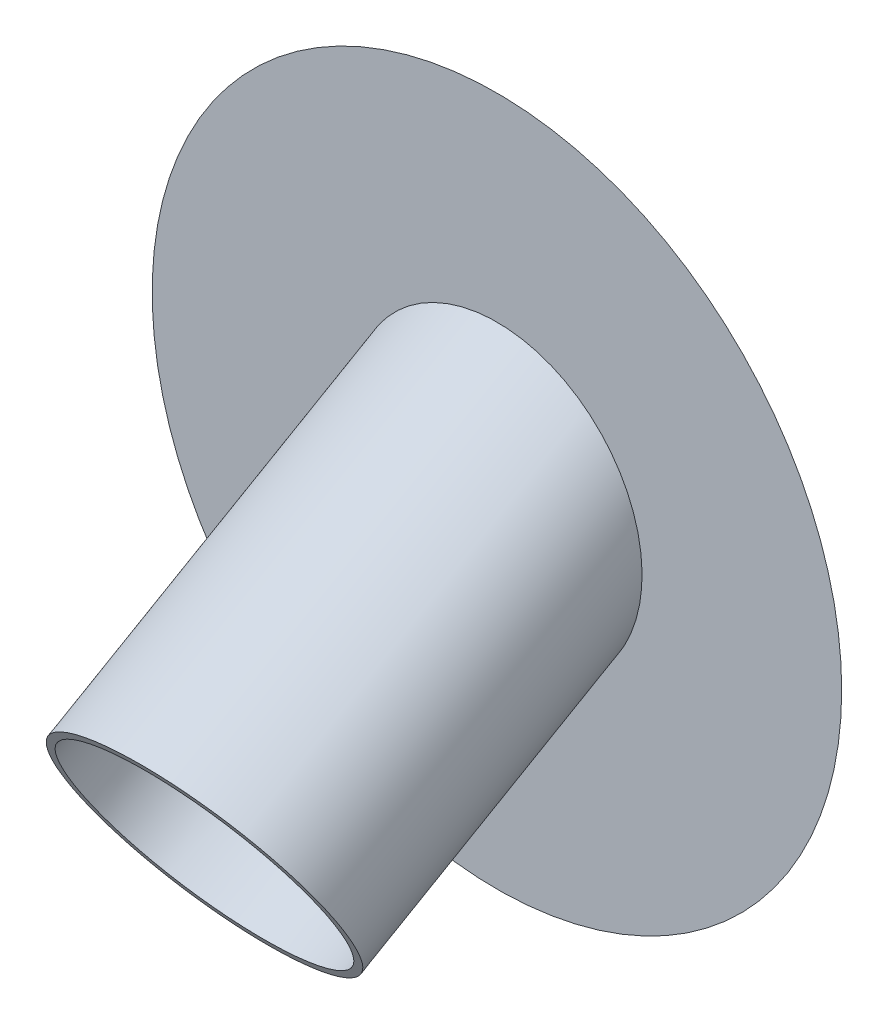
ISO-10303-21;
HEADER;
FILE_DESCRIPTION(('STEP AP214'),'2;1');
FILE_NAME('part.step','',(''),(''),'','','');
FILE_SCHEMA(('AUTOMOTIVE_DESIGN { 1 0 10303 214 1 1 1 1 }'));
ENDSEC;
DATA;
#1=APPLICATION_CONTEXT('core data for automotive mechanical design processes');
#2=APPLICATION_PROTOCOL_DEFINITION('international standard','automotive_design',2000,#1);
#3=PRODUCT_CONTEXT('',#1,'mechanical');
#4=PRODUCT('Part','Part','',(#3));
#5=PRODUCT_RELATED_PRODUCT_CATEGORY('part','',(#4));
#6=PRODUCT_DEFINITION_FORMATION('','',#4);
#7=PRODUCT_DEFINITION_CONTEXT('part definition',#1,'design');
#8=PRODUCT_DEFINITION('design','',#6,#7);
#9=PRODUCT_DEFINITION_SHAPE('','',#8);
#10=(LENGTH_UNIT() NAMED_UNIT(*) SI_UNIT(.MILLI.,.METRE.));
#11=(NAMED_UNIT(*) PLANE_ANGLE_UNIT() SI_UNIT($,.RADIAN.));
#12=(NAMED_UNIT(*) SI_UNIT($,.STERADIAN.) SOLID_ANGLE_UNIT());
#13=UNCERTAINTY_MEASURE_WITH_UNIT(LENGTH_MEASURE(1.E-05),#10,'distance_accuracy_value','');
#14=(GEOMETRIC_REPRESENTATION_CONTEXT(3) GLOBAL_UNCERTAINTY_ASSIGNED_CONTEXT((#13)) GLOBAL_UNIT_ASSIGNED_CONTEXT((#10,
#11,#12)) REPRESENTATION_CONTEXT('',''));
#15=CARTESIAN_POINT('',(0.,0.,0.));
#16=DIRECTION('',(0.,0.,1.));
#17=DIRECTION('',(1.,0.,0.));
#18=AXIS2_PLACEMENT_3D('',#15,#16,#17);
#19=CARTESIAN_POINT('',(-18.2080308915422,26.0465192443004,-45.1138946914487));
#20=CARTESIAN_POINT('',(-18.2080308915422,25.0686767320751,-45.678452329107));
#21=CARTESIAN_POINT('',(-18.0720908259398,24.1111858148349,-46.2312599679223));
#22=CARTESIAN_POINT('',(-17.6755524278814,22.7037878327175,-47.0438215717547));
#23=CARTESIAN_POINT('',(-17.5101059659842,22.2375221611436,-47.3130201827518));
#24=CARTESIAN_POINT('',(-17.1170157653334,21.3239029057431,-47.8404985057941));
#25=CARTESIAN_POINT('',(-16.8915451322552,20.8808004251776,-48.0963238422272));
#26=CARTESIAN_POINT('',(-16.386141843818,20.0204037683929,-48.5930740836317));
#27=CARTESIAN_POINT('',(-16.1061957936727,19.603115939656,-48.8339953238825));
#28=CARTESIAN_POINT('',(-15.4932874154907,18.7936634813918,-49.3013329185575));
#29=CARTESIAN_POINT('',(-15.1583281194544,18.3995099248571,-49.5288975805249));
#30=CARTESIAN_POINT('',(-14.0901279097118,17.2716251888331,-50.1800821364832));
#31=CARTESIAN_POINT('',(-13.2973567872076,16.5929598669222,-50.5719097427781));
#32=CARTESIAN_POINT('',(-11.9980504768333,15.6750308132245,-51.1018763290275));
#33=CARTESIAN_POINT('',(-11.5442983032577,15.3846946326905,-51.2695020010143));
#34=CARTESIAN_POINT('',(-10.6111325932973,14.8439020628175,-51.5817287368062));
#35=CARTESIAN_POINT('',(-10.1328742402689,14.5938077809624,-51.7261207377581));
#36=CARTESIAN_POINT('',(-8.66502453452607,13.9010369640562,-52.1260921553855));
#37=CARTESIAN_POINT('',(-7.6426340631868,13.5153933542508,-52.3487435973179));
#38=CARTESIAN_POINT('',(-6.04531878376521,13.0477444520507,-52.6187408168894));
#39=CARTESIAN_POINT('',(-5.50584481320515,12.9116475773344,-52.6973163841427));
#40=CARTESIAN_POINT('',(-4.42250225776547,12.6796758600995,-52.8312453175327));
#41=CARTESIAN_POINT('',(-3.87719928441678,12.5833790191343,-52.886842324586));
#42=CARTESIAN_POINT('',(-2.23067046471249,12.3520636383215,-53.020392321966));
#43=CARTESIAN_POINT('',(-1.11737611958802,12.2741351508091,-53.0653843552088));
#44=CARTESIAN_POINT('',(1.13180209622181,12.2748083518274,-53.0649956824197));
#45=CARTESIAN_POINT('',(2.24153578156134,12.3531866523204,-53.0197439495314));
#46=CARTESIAN_POINT('',(4.43210774505371,12.6617428193338,-52.8415989634462));
#47=CARTESIAN_POINT('',(5.51295796158799,12.8918579685817,-52.7087419200832));
#48=CARTESIAN_POINT('',(7.11087843525395,13.3597234181207,-52.4386196768474));
#49=CARTESIAN_POINT('',(7.63421341629993,13.534805362123,-52.3375360693474));
#50=CARTESIAN_POINT('',(8.65462780134358,13.9204976918949,-52.1148564989293));
#51=CARTESIAN_POINT('',(9.15296392506364,14.131470488366,-51.9930512980949));
#52=CARTESIAN_POINT('',(10.6118329406213,14.8195721806204,-51.595775600842));
#53=CARTESIAN_POINT('',(11.5366487753278,15.3512395469268,-51.2888173037857));
#54=CARTESIAN_POINT('',(12.8435856783609,16.2713352976508,-50.757599774425));
#55=CARTESIAN_POINT('',(13.2639854704254,16.5978361316961,-50.5690944299983));
#56=CARTESIAN_POINT('',(14.0559213384341,17.2773366901,-50.1767845996893));
#57=CARTESIAN_POINT('',(14.4300770360119,17.6321072568038,-49.9719577175023));
#58=CARTESIAN_POINT('',(15.4858281638205,18.7423607372323,-49.3309525717082));
#59=CARTESIAN_POINT('',(16.1016181721902,19.543158415395,-48.8686118166545));
#60=CARTESIAN_POINT('',(17.1319915091084,21.2833082105735,-47.8639358639779));
#61=CARTESIAN_POINT('',(17.5248736951707,22.1871894752777,-47.3420797724855));
#62=CARTESIAN_POINT('',(17.9269650589811,23.587747310811,-46.5334673291247));
#63=CARTESIAN_POINT('',(18.0297489576968,24.0624473765785,-46.2593991183695));
#64=CARTESIAN_POINT('',(18.1346433745884,24.7868743196363,-45.8411510277869));
#65=CARTESIAN_POINT('',(18.161403727515,25.0312651386358,-45.70005192265));
#66=CARTESIAN_POINT('',(18.1974797572798,25.5179193583012,-45.4190819779239));
#67=CARTESIAN_POINT('',(18.2069220555508,25.7606221748995,-45.2789574414279));
#68=CARTESIAN_POINT('',(18.2120062462621,26.971076619007,-44.5801012422806));
#69=CARTESIAN_POINT('',(18.0826563629694,27.9297502925213,-44.0266107388121));
#70=CARTESIAN_POINT('',(17.6876454398434,29.3531635019524,-43.204802739179));
#71=CARTESIAN_POINT('',(17.5229092447295,29.8212552483206,-42.9345498434079));
#72=CARTESIAN_POINT('',(17.1357129726102,30.7298326961115,-42.4099824093462));
#73=CARTESIAN_POINT('',(16.9125957663502,31.172766725982,-42.1542543279672));
#74=CARTESIAN_POINT('',(16.409230545134,32.0366590646814,-41.6554858536682));
#75=CARTESIAN_POINT('',(16.1287085802233,32.457970869553,-41.4122413697129));
#76=CARTESIAN_POINT('',(15.5116656231737,33.2771808919475,-40.9392702427605));
#77=CARTESIAN_POINT('',(15.1799440213041,33.6688229083279,-40.7131556191773));
#78=CARTESIAN_POINT('',(14.1199210959585,34.7935317214935,-40.0638046831362));
#79=CARTESIAN_POINT('',(13.3256039010775,35.4780681645875,-39.6685873834458));
#80=CARTESIAN_POINT('',(11.5802540246892,36.7151748912716,-38.9543434817784));
#81=CARTESIAN_POINT('',(10.6513387869154,37.2526334146858,-38.644041658607));
#82=CARTESIAN_POINT('',(9.181809431582,37.9490085011643,-38.2419893149717));
#83=CARTESIAN_POINT('',(8.67916469762992,38.1626744362771,-38.1186292298176));
#84=CARTESIAN_POINT('',(7.64849251479404,38.5534060888704,-37.893040205012));
#85=CARTESIAN_POINT('',(7.12242305542902,38.7295371255395,-37.7913509035784));
#86=CARTESIAN_POINT('',(5.53324039305754,39.1960212781778,-37.5220261524801));
#87=CARTESIAN_POINT('',(4.45150148139667,39.4280071057587,-37.388089072478));
#88=CARTESIAN_POINT('',(2.79672091068246,39.6619245233493,-37.2530367884639));
#89=CARTESIAN_POINT('',(2.23858034597459,39.7208363595307,-37.2190240239862));
#90=CARTESIAN_POINT('',(1.11625154074938,39.7992916680637,-37.1737278304853));
#91=CARTESIAN_POINT('',(0.556840381311056,39.8185879727329,-37.1625871037901));
#92=CARTESIAN_POINT('',(-1.11629562777199,39.8185274574704,-37.1626220422933));
#93=CARTESIAN_POINT('',(-2.22496517962788,39.7417006248081,-37.2069780348118));
#94=CARTESIAN_POINT('',(-3.8776924508454,39.5096279761457,-37.3409652409886));
#95=CARTESIAN_POINT('',(-4.42716619974421,39.4126186085706,-37.396973625472));
#96=CARTESIAN_POINT('',(-5.52133583584159,39.177814496966,-37.5325378425138));
#97=CARTESIAN_POINT('',(-6.05873045411751,39.0416035537296,-37.6111792672579));
#98=CARTESIAN_POINT('',(-7.64222617869835,38.5772864424617,-37.8792528764377));
#99=CARTESIAN_POINT('',(-8.65990580361272,38.1940135640715,-38.1005355759494));
#100=CARTESIAN_POINT('',(-10.126355404483,37.502507394055,-38.4997768493547));
#101=CARTESIAN_POINT('',(-10.6050978365776,37.2524512883335,-38.6441468093055));
#102=CARTESIAN_POINT('',(-11.5409957680289,36.7104383733515,-38.9570781116746));
#103=CARTESIAN_POINT('',(-11.9946235408695,36.420234695629,-39.1246272831275));
#104=CARTESIAN_POINT('',(-13.2916283534485,35.5045108711448,-39.6533206796968));
#105=CARTESIAN_POINT('',(-14.0802621650459,34.8295710684043,-40.0429973564958));
#106=CARTESIAN_POINT('',(-15.1406635813506,33.7132739330303,-40.6874918080997));
#107=CARTESIAN_POINT('',(-15.4735665060795,33.3237422028272,-40.9123880573903));
#108=CARTESIAN_POINT('',(-16.0946496555651,32.5067664379208,-41.3840692351804));
#109=CARTESIAN_POINT('',(-16.3778960246247,32.08547095179,-41.6273042975064));
#110=CARTESIAN_POINT('',(-17.1380802641165,30.7948874369127,-42.3724230372325));
#111=CARTESIAN_POINT('',(-17.5301935656011,29.8944213338146,-42.8923073842523));
#112=CARTESIAN_POINT('',(-17.933432187474,28.4790922846711,-43.7094479917672));
#113=CARTESIAN_POINT('',(-18.0366891952287,27.9945875758858,-43.9891769158081));
#114=CARTESIAN_POINT('',(-18.1735275256795,27.0247205367756,-44.5491299119165));
#115=CARTESIAN_POINT('',(-18.2080308915422,26.5354405004131,-44.8316158726195));
#116=CARTESIAN_POINT('',(-18.2080308915422,26.0465192443004,-45.1138946914487));
#117=B_SPLINE_CURVE_WITH_KNOTS('',3,(#19,#20,#21,#22,#23,#24,#25,#26,#27,#28,#29,#30,#31,#32,
#33,#34,#35,#36,#37,#38,#39,#40,#41,#42,#43,#44,#45,#46,#47,#48,#49,#50,#51,#52,#53,#54,#55,#56,
#57,#58,#59,#60,#61,#62,#63,#64,#65,#66,#67,#68,#69,#70,#71,#72,#73,#74,#75,#76,#77,#78,#79,#80,
#81,#82,#83,#84,#85,#86,#87,#88,#89,#90,#91,#92,#93,#94,#95,#96,#97,#98,#99,#100,#101,#102,#103,
#104,#105,#106,#107,#108,#109,#110,#111,#112,#113,#114,#115,#116),.UNSPECIFIED.,.T.,.F.,(4,2,2,
2,2,2,2,2,2,2,2,2,2,2,2,2,2,2,2,2,2,2,2,2,2,2,2,2,2,2,2,2,2,2,2,2,2,2,2,2,2,2,2,2,2,2,2,2,4),
(0.,0.03125,0.046875,0.0625000000000001,0.0781250000000001,0.0937500000000002,0.125,0.140625,
0.15625,0.1875,0.203125,0.21875,0.25,0.28125,0.3125,0.328125,0.34375,0.375,0.390625,0.40625,
0.4375,0.46875,0.484375,0.4921875,0.5,0.53125,0.546875,0.5625,0.578125,0.59375,0.625,0.65625,
0.671875,0.6875,0.71875,0.734375,0.75,0.78125,0.796875,0.8125,0.84375,0.859375,0.875,0.90625,
0.921875,0.9375,0.96875,0.984375,1.),.UNSPECIFIED.);
#118=DIRECTION('',(0.,-0.500000000000001,0.866025403784438));
#119=VECTOR('',#118,1.);
#120=SURFACE_OF_LINEAR_EXTRUSION('',#117,#119);
#121=CARTESIAN_POINT('',(-18.2080308915422,0.,0.));
#122=CARTESIAN_POINT('',(-18.207969405308,0.592622129350855,0.));
#123=CARTESIAN_POINT('',(-18.1795638226183,1.1855950613576,0.));
#124=CARTESIAN_POINT('',(-18.108624910561,1.9230446008679,0.));
#125=CARTESIAN_POINT('',(-18.0926519835811,2.07045145279375,0.));
#126=CARTESIAN_POINT('',(-18.0571481369632,2.36483329247356,0.));
#127=CARTESIAN_POINT('',(-18.0376175157474,2.51180831539974,0.));
#128=CARTESIAN_POINT('',(-17.9737907391131,2.9519780260343,0.));
#129=CARTESIAN_POINT('',(-17.9242585693009,3.2444287377518,0.));
#130=CARTESIAN_POINT('',(-17.8110863396817,3.8271057667507,0.));
#131=CARTESIAN_POINT('',(-17.7474218991262,4.11732733212051,0.));
#132=CARTESIAN_POINT('',(-17.6062666898334,4.69436834180093,0.));
#133=CARTESIAN_POINT('',(-17.5287768995074,4.98118802532975,0.));
#134=CARTESIAN_POINT('',(-17.3600168360541,5.55064327353075,0.));
#135=CARTESIAN_POINT('',(-17.2687513371096,5.83328025066621,0.));
#136=CARTESIAN_POINT('',(-17.0726064416325,6.39385507239992,0.));
#137=CARTESIAN_POINT('',(-16.9677233608618,6.67179162221294,0.));
#138=CARTESIAN_POINT('',(-16.6608061118697,7.42941729166875,0.));
#139=CARTESIAN_POINT('',(-16.4450354278203,7.90361692178952,0.));
#140=CARTESIAN_POINT('',(-15.9741364605243,8.83203198793285,0.));
#141=CARTESIAN_POINT('',(-15.7190110438114,9.28624887637092,0.));
#142=CARTESIAN_POINT('',(-15.3082586355767,9.94981880041805,0.));
#143=CARTESIAN_POINT('',(-15.1667059834294,10.1679927667297,0.));
#144=CARTESIAN_POINT('',(-14.8744641203259,10.5981250766664,0.));
#145=CARTESIAN_POINT('',(-14.7237756526375,10.8100839238623,0.));
#146=CARTESIAN_POINT('',(-14.4135748289044,11.2274465484515,0.));
#147=CARTESIAN_POINT('',(-14.2540624184905,11.4328502854428,0.));
#148=CARTESIAN_POINT('',(-13.9264012492842,11.8366538614833,0.));
#149=CARTESIAN_POINT('',(-13.7582518797199,12.0350532035305,0.));
#150=CARTESIAN_POINT('',(-13.2432832127265,12.6168856345335,0.));
#151=CARTESIAN_POINT('',(-12.8840663569621,12.9894787678725,0.));
#152=CARTESIAN_POINT('',(-12.1354792124237,13.7028979120216,0.));
#153=CARTESIAN_POINT('',(-11.7461086435404,14.0437236276671,0.));
#154=CARTESIAN_POINT('',(-10.9396657419227,14.6911225458464,0.));
#155=CARTESIAN_POINT('',(-10.5225902910895,14.9976918824807,0.));
#156=CARTESIAN_POINT('',(-9.87862318347301,15.4299495273045,0.));
#157=CARTESIAN_POINT('',(-9.66087820964556,15.5694527895523,0.));
#158=CARTESIAN_POINT('',(-9.21967542331068,15.8390988775594,0.));
#159=CARTESIAN_POINT('',(-8.99621817476299,15.9692426225617,0.));
#160=CARTESIAN_POINT('',(-8.54581106303305,16.2187986676365,0.));
#161=CARTESIAN_POINT('',(-8.31890548806177,16.3382909606145,0.));
#162=CARTESIAN_POINT('',(-7.86027097983319,16.5674722972506,0.));
#163=CARTESIAN_POINT('',(-7.62854332245112,16.6771638944162,0.));
#164=CARTESIAN_POINT('',(-7.16061142588904,16.88661980412,0.));
#165=CARTESIAN_POINT('',(-6.92440675187805,16.986383146432,0.));
#166=CARTESIAN_POINT('',(-6.44800701940456,17.1758598755121,0.));
#167=CARTESIAN_POINT('',(-6.20781168157481,17.2655725552485,0.));
#168=CARTESIAN_POINT('',(-5.48184213211329,17.5192489818608,0.));
#169=CARTESIAN_POINT('',(-4.99053994350464,17.6678158193206,0.));
#170=CARTESIAN_POINT('',(-4.24566540667484,17.8589566799071,0.));
#171=CARTESIAN_POINT('',(-3.99601932424301,17.9173911687568,0.));
#172=CARTESIAN_POINT('',(-3.49447366288117,18.0235920102107,0.));
#173=CARTESIAN_POINT('',(-3.24257433417632,18.0713595324632,0.));
#174=CARTESIAN_POINT('',(-2.7386549379042,18.1559152113362,0.));
#175=CARTESIAN_POINT('',(-2.48664671438149,18.1927739741889,0.));
#176=CARTESIAN_POINT('',(-1.9813174904148,18.2557750586611,0.));
#177=CARTESIAN_POINT('',(-1.72799650342722,18.2819174899086,0.));
#178=CARTESIAN_POINT('',(-0.966693144790526,18.3441731720162,0.));
#179=CARTESIAN_POINT('',(-0.457258550230268,18.3641335928166,0.));
#180=CARTESIAN_POINT('',(0.306587991134367,18.361918507321,0.));
#181=CARTESIAN_POINT('',(0.561178012367745,18.3558186448419,0.));
#182=CARTESIAN_POINT('',(1.06987006785161,18.3328504216701,0.));
#183=CARTESIAN_POINT('',(1.32397210712798,18.3159821724873,0.));
#184=CARTESIAN_POINT('',(2.08488643362869,18.2492867634372,0.));
#185=CARTESIAN_POINT('',(2.59041786877504,18.1833686074652,0.));
#186=CARTESIAN_POINT('',(3.34240383232563,18.0528452822705,0.));
#187=CARTESIAN_POINT('',(3.59175352077423,18.0041313544814,0.));
#188=CARTESIAN_POINT('',(4.08819991435678,17.8962849744248,0.));
#189=CARTESIAN_POINT('',(4.33529673309737,17.8371530506015,0.));
#190=CARTESIAN_POINT('',(4.82676124957489,17.7084924937651,0.));
#191=CARTESIAN_POINT('',(5.07112901672341,17.6389641258289,0.));
#192=CARTESIAN_POINT('',(5.55671384884555,17.4896401707965,0.));
#193=CARTESIAN_POINT('',(5.79793062388423,17.4098436461164,0.));
#194=CARTESIAN_POINT('',(6.51609070509549,17.1554118577277,0.));
#195=CARTESIAN_POINT('',(6.98778576687587,16.9656708768516,0.));
#196=CARTESIAN_POINT('',(7.91374413865358,16.547256497799,0.));
#197=CARTESIAN_POINT('',(8.36799946929043,16.3185655326012,0.));
#198=CARTESIAN_POINT('',(9.25672820570247,15.8232573525966,0.));
#199=CARTESIAN_POINT('',(9.6911564870907,15.5565588152807,0.));
#200=CARTESIAN_POINT('',(10.3247621593441,15.1301523807704,0.));
#201=CARTESIAN_POINT('',(10.5329369378,14.983640625361,0.));
#202=CARTESIAN_POINT('',(10.9429258069465,14.6819723852647,0.));
#203=CARTESIAN_POINT('',(11.1447399660158,14.52681599356,0.));
#204=CARTESIAN_POINT('',(11.7401731690832,14.0487402753812,0.));
#205=CARTESIAN_POINT('',(12.1237810936137,13.7132156476854,0.));
#206=CARTESIAN_POINT('',(12.8617723125446,13.0115135054858,0.));
#207=CARTESIAN_POINT('',(13.2161553397196,12.6453357107585,0.));
#208=CARTESIAN_POINT('',(13.8949757691768,11.8823299822485,0.));
#209=CARTESIAN_POINT('',(14.2192250912123,11.4853346811375,0.));
#210=CARTESIAN_POINT('',(14.8334726524049,10.6656097521367,0.));
#211=CARTESIAN_POINT('',(15.1234706732886,10.2428799602747,0.));
#212=CARTESIAN_POINT('',(15.5311517467388,9.59177724298184,0.));
#213=CARTESIAN_POINT('',(15.6625158053793,9.37186364102246,0.));
#214=CARTESIAN_POINT('',(15.9159316234002,8.92680847312022,0.));
#215=CARTESIAN_POINT('',(16.0379857707565,8.7016682672486,0.));
#216=CARTESIAN_POINT('',(16.3899051377146,8.01886579671802,0.));
#217=CARTESIAN_POINT('',(16.6055512245954,7.55378342797094,0.));
#218=CARTESIAN_POINT('',(16.9990198862518,6.60343244536605,0.));
#219=CARTESIAN_POINT('',(17.1765198740753,6.11803020506357,0.));
#220=CARTESIAN_POINT('',(17.4117349945531,5.38014998294476,0.));
#221=CARTESIAN_POINT('',(17.4849754898834,5.13252572728701,0.));
#222=CARTESIAN_POINT('',(17.621072645871,4.63444643618591,0.));
#223=CARTESIAN_POINT('',(17.6839302003305,4.38399164639062,0.));
#224=CARTESIAN_POINT('',(17.7991033647779,3.88065328785536,0.));
#225=CARTESIAN_POINT('',(17.85141812981,3.62776952614479,0.));
#226=CARTESIAN_POINT('',(17.9454933576838,3.12004777877314,0.));
#227=CARTESIAN_POINT('',(17.9872539145315,2.86520981053899,0.));
#228=CARTESIAN_POINT('',(18.0600455981777,2.35400679635999,0.));
#229=CARTESIAN_POINT('',(18.0910768150229,2.09764176324951,0.));
#230=CARTESIAN_POINT('',(18.1423409024711,1.58383230682876,0.));
#231=CARTESIAN_POINT('',(18.1625736135528,1.32638786762954,0.));
#232=CARTESIAN_POINT('',(18.1923272878807,0.809155734538497,0.));
#233=CARTESIAN_POINT('',(18.2017760437612,0.549363850677787,0.));
#234=CARTESIAN_POINT('',(18.2098250435268,0.0296478948586195,0.));
#235=CARTESIAN_POINT('',(18.2084257486393,-0.230276171009996,0.));
#236=CARTESIAN_POINT('',(18.1878114923539,-1.0096596677335,0.));
#237=CARTESIAN_POINT('',(18.1521855538013,-1.5288238711787,0.));
#238=CARTESIAN_POINT('',(18.0661940861123,-2.30368551485625,0.));
#239=CARTESIAN_POINT('',(18.0321041661965,-2.56132869085481,0.));
#240=CARTESIAN_POINT('',(17.9530944386196,-3.0749688154219,0.));
#241=CARTESIAN_POINT('',(17.9081748608463,-3.33096579881676,0.));
#242=CARTESIAN_POINT('',(17.8075926771346,-3.84095416966564,0.));
#243=CARTESIAN_POINT('',(17.7519251849848,-4.09494459002086,0.));
#244=CARTESIAN_POINT('',(17.6299845909589,-4.60036881693711,0.));
#245=CARTESIAN_POINT('',(17.5637114992524,-4.85180262594945,0.));
#246=CARTESIAN_POINT('',(17.4203540550402,-5.35246212814905,0.));
#247=CARTESIAN_POINT('',(17.3432349605249,-5.6016778758966,0.));
#248=CARTESIAN_POINT('',(17.1784742236986,-6.0966123168199,0.));
#249=CARTESIAN_POINT('',(17.0908323587776,-6.34233093589053,0.));
#250=CARTESIAN_POINT('',(16.9052311274268,-6.82972375987101,0.));
#251=CARTESIAN_POINT('',(16.807276024266,-7.07139958847598,0.));
#252=CARTESIAN_POINT('',(16.6012919061496,-7.55039271439029,0.));
#253=CARTESIAN_POINT('',(16.493263733594,-7.78771037418535,0.));
#254=CARTESIAN_POINT('',(16.267233123752,-8.25766105997812,0.));
#255=CARTESIAN_POINT('',(16.1492271283267,-8.49029237787392,0.));
#256=CARTESIAN_POINT('',(15.9034162630864,-8.95023712207335,0.));
#257=CARTESIAN_POINT('',(15.7756132148908,-9.17755152677057,0.));
#258=CARTESIAN_POINT('',(15.3777384059683,-9.8510170886634,0.));
#259=CARTESIAN_POINT('',(15.0931674477473,-10.2887603608911,0.));
#260=CARTESIAN_POINT('',(14.6404877435939,-10.9245138706731,0.));
#261=CARTESIAN_POINT('',(14.4858544326341,-11.1322895819759,0.));
#262=CARTESIAN_POINT('',(14.1679060494219,-11.5410816878455,0.));
#263=CARTESIAN_POINT('',(14.0045912193652,-11.7420982707223,0.));
#264=CARTESIAN_POINT('',(13.5020360886761,-12.3344833272216,0.));
#265=CARTESIAN_POINT('',(13.150122888188,-12.7152745639219,0.));
#266=CARTESIAN_POINT('',(12.5991525047006,-13.2629068409375,0.));
#267=CARTESIAN_POINT('',(12.4116242191833,-13.4415431007077,0.));
#268=CARTESIAN_POINT('',(12.0291553137343,-13.7907131365689,0.));
#269=CARTESIAN_POINT('',(11.8342150869418,-13.9612473413275,0.));
#270=CARTESIAN_POINT('',(11.4372457437677,-14.2938166895698,0.));
#271=CARTESIAN_POINT('',(11.2352171495758,-14.4558524569361,0.));
#272=CARTESIAN_POINT('',(10.8243570470643,-14.7711343384854,0.));
#273=CARTESIAN_POINT('',(10.6155243586252,-14.9243789150399,0.));
#274=CARTESIAN_POINT('',(10.1934078801344,-15.2204507944761,0.));
#275=CARTESIAN_POINT('',(9.98018136259135,-15.3633597167512,0.));
#276=CARTESIAN_POINT('',(9.54790567058852,-15.6400939956266,0.));
#277=CARTESIAN_POINT('',(9.3288559601596,-15.7739185120379,0.));
#278=CARTESIAN_POINT('',(8.66330304462266,-16.1613559619564,0.));
#279=CARTESIAN_POINT('',(8.20847756637456,-16.4008755832942,0.));
#280=CARTESIAN_POINT('',(7.2802274410172,-16.840424852325,0.));
#281=CARTESIAN_POINT('',(6.80680323682398,-17.04045543974,0.));
#282=CARTESIAN_POINT('',(5.84491846574702,-17.3996442658713,0.));
#283=CARTESIAN_POINT('',(5.35646522784527,-17.5588220836644,0.));
#284=CARTESIAN_POINT('',(4.37057668146055,-17.8340236028373,0.));
#285=CARTESIAN_POINT('',(3.8732083400864,-17.9502878252759,0.));
#286=CARTESIAN_POINT('',(2.87039933243379,-18.1406470154695,0.));
#287=CARTESIAN_POINT('',(2.36495864218468,-18.2147418579795,0.));
#288=CARTESIAN_POINT('',(1.60356488734472,-18.2934442192536,0.));
#289=CARTESIAN_POINT('',(1.34920101805328,-18.3142721775292,0.));
#290=CARTESIAN_POINT('',(0.839828248454309,-18.3451070003792,0.));
#291=CARTESIAN_POINT('',(0.584819350605908,-18.3551139061463,0.));
#292=CARTESIAN_POINT('',(-0.180517051648748,-18.3690044175357,0.));
#293=CARTESIAN_POINT('',(-0.691270921565309,-18.356769791906,0.));
#294=CARTESIAN_POINT('',(-1.45412314582678,-18.3060538881616,0.));
#295=CARTESIAN_POINT('',(-1.70743503525035,-18.2838193954391,0.));
#296=CARTESIAN_POINT('',(-2.21289768951477,-18.2286527041513,0.));
#297=CARTESIAN_POINT('',(-2.46504852527541,-18.195721168018,0.));
#298=CARTESIAN_POINT('',(-2.96771278505671,-18.1192719941994,0.));
#299=CARTESIAN_POINT('',(-3.21822636328677,-18.0757553686953,0.));
#300=CARTESIAN_POINT('',(-3.71725123675818,-17.9782177601517,0.));
#301=CARTESIAN_POINT('',(-3.96576201507223,-17.9241941502964,0.));
#302=CARTESIAN_POINT('',(-4.70744831298131,-17.746475147685,0.));
#303=CARTESIAN_POINT('',(-5.19695847799929,-17.6071041141677,0.));
#304=CARTESIAN_POINT('',(-6.16252157541092,-17.2876841276845,0.));
#305=CARTESIAN_POINT('',(-6.63857437194084,-17.1076347642007,0.));
#306=CARTESIAN_POINT('',(-7.34013330750256,-16.8081019019311,0.));
#307=CARTESIAN_POINT('',(-7.57200101688718,-16.7032940490764,0.));
#308=CARTESIAN_POINT('',(-8.0310947628422,-16.4839773280885,0.));
#309=CARTESIAN_POINT('',(-8.25832122014019,-16.3694693441555,0.));
#310=CARTESIAN_POINT('',(-8.70773236113942,-16.1309602868545,0.));
#311=CARTESIAN_POINT('',(-8.92991701432635,-16.0069591560514,0.));
#312=CARTESIAN_POINT('',(-9.36891393451156,-15.7497527321023,0.));
#313=CARTESIAN_POINT('',(-9.58572579931371,-15.6165467527106,0.));
#314=CARTESIAN_POINT('',(-10.0135723252212,-15.3411843725425,0.));
#315=CARTESIAN_POINT('',(-10.2246074534927,-15.1990286986167,0.));
#316=CARTESIAN_POINT('',(-10.6404962108282,-14.9059961321405,0.));
#317=CARTESIAN_POINT('',(-10.8453499944732,-14.7551194579576,0.));
#318=CARTESIAN_POINT('',(-11.4501748938764,-14.2897862003002,0.));
#319=CARTESIAN_POINT('',(-11.8404966495744,-13.9625703071388,0.));
#320=CARTESIAN_POINT('',(-12.4050665728591,-13.4476531929228,0.));
#321=CARTESIAN_POINT('',(-12.5901302823331,-13.2716112909752,0.));
#322=CARTESIAN_POINT('',(-12.9527663057316,-12.9119439041161,0.));
#323=CARTESIAN_POINT('',(-13.1303386722051,-12.7283184724181,0.));
#324=CARTESIAN_POINT('',(-13.4775966509044,-12.3537550211021,0.));
#325=CARTESIAN_POINT('',(-13.6472822226423,-12.1628169639531,0.));
#326=CARTESIAN_POINT('',(-13.9784556514842,-11.7739787787295,0.));
#327=CARTESIAN_POINT('',(-14.1399434757434,-11.5760786227664,0.));
#328=CARTESIAN_POINT('',(-14.6118975305684,-10.9723729625626,0.));
#329=CARTESIAN_POINT('',(-14.9097967858906,-10.5566244231565,0.));
#330=CARTESIAN_POINT('',(-15.4699641667833,-9.70186420962455,0.));
#331=CARTESIAN_POINT('',(-15.7322326251949,-9.26285275285988,0.));
#332=CARTESIAN_POINT('',(-16.2213479959414,-8.36066495741586,0.));
#333=CARTESIAN_POINT('',(-16.4478749812377,-7.89731497979522,0.));
#334=CARTESIAN_POINT('',(-16.8613883103869,-6.95325023733702,0.));
#335=CARTESIAN_POINT('',(-17.0483711544,-6.47253393990428,0.));
#336=CARTESIAN_POINT('',(-17.3811763366541,-5.497942171797,0.));
#337=CARTESIAN_POINT('',(-17.5270643542153,-5.00408909559695,0.));
#338=CARTESIAN_POINT('',(-17.7772646873561,-4.00599521815583,0.));
#339=CARTESIAN_POINT('',(-17.8815848584648,-3.50175639858259,0.));
#340=CARTESIAN_POINT('',(-18.0053102938874,-2.74685490843979,0.));
#341=CARTESIAN_POINT('',(-18.0408293062826,-2.49873327017651,0.));
#342=CARTESIAN_POINT('',(-18.1017066589251,-2.00129600390858,0.));
#343=CARTESIAN_POINT('',(-18.1270676017846,-1.75198069832221,0.));
#344=CARTESIAN_POINT('',(-18.1676072256408,-1.25245626275045,0.));
#345=CARTESIAN_POINT('',(-18.1827833190616,-1.00224692184519,0.));
#346=CARTESIAN_POINT('',(-18.2030096400425,-0.501379390468685,0.));
#347=CARTESIAN_POINT('',(-18.2080569045695,-0.25072109011833,0.));
#348=CARTESIAN_POINT('',(-18.2080308915422,0.,0.));
#349=B_SPLINE_CURVE_WITH_KNOTS('',3,(#121,#122,#123,#124,#125,#126,#127,#128,#129,#130,#131,
#132,#133,#134,#135,#136,#137,#138,#139,#140,#141,#142,#143,#144,#145,#146,#147,#148,#149,#150,
#151,#152,#153,#154,#155,#156,#157,#158,#159,#160,#161,#162,#163,#164,#165,#166,#167,#168,#169,
#170,#171,#172,#173,#174,#175,#176,#177,#178,#179,#180,#181,#182,#183,#184,#185,#186,#187,#188,
#189,#190,#191,#192,#193,#194,#195,#196,#197,#198,#199,#200,#201,#202,#203,#204,#205,#206,#207,
#208,#209,#210,#211,#212,#213,#214,#215,#216,#217,#218,#219,#220,#221,#222,#223,#224,#225,#226,
#227,#228,#229,#230,#231,#232,#233,#234,#235,#236,#237,#238,#239,#240,#241,#242,#243,#244,#245,
#246,#247,#248,#249,#250,#251,#252,#253,#254,#255,#256,#257,#258,#259,#260,#261,#262,#263,#264,
#265,#266,#267,#268,#269,#270,#271,#272,#273,#274,#275,#276,#277,#278,#279,#280,#281,#282,#283,
#284,#285,#286,#287,#288,#289,#290,#291,#292,#293,#294,#295,#296,#297,#298,#299,#300,#301,#302,
#303,#304,#305,#306,#307,#308,#309,#310,#311,#312,#313,#314,#315,#316,#317,#318,#319,#320,#321,
#322,#323,#324,#325,#326,#327,#328,#329,#330,#331,#332,#333,#334,#335,#336,#337,#338,#339,#340,
#341,#342,#343,#344,#345,#346,#347,#348),.UNSPECIFIED.,.T.,.F.,(4,2,2,2,2,2,2,2,2,2,2,2,2,2,2,2,
2,2,2,2,2,2,2,2,2,2,2,2,2,2,2,2,2,2,2,2,2,2,2,2,2,2,2,2,2,2,2,2,2,2,2,2,2,2,2,2,2,2,2,2,2,2,2,2,
2,2,2,2,2,2,2,2,2,2,2,2,2,2,2,2,2,2,2,2,2,2,2,2,2,2,2,2,2,2,2,2,2,2,2,2,2,2,2,2,2,2,2,2,2,2,2,2,
2,4),(0.,1.77748546905338,2.22228132861084,2.66703989552138,3.55652275949113,4.44755223750375,
5.3385186829026,6.22917705619974,7.12007690128788,8.6810701348111,10.2419497218055,
11.0219664754432,11.8019198537365,12.5818780382868,13.3618914545681,14.9125090253992,
16.4631410022412,18.0139477945842,18.7895582243141,19.5650923733156,20.3341997648067,
21.1031061824481,21.8720876668678,22.6411232127374,24.1787209455995,24.9477282240867,
25.7166511383631,26.4804825779618,27.2443062033822,28.7716143292936,29.5354209013965,
30.2992195641748,31.8264850935569,32.5885074424891,33.3504911495911,34.1124554318041,
34.8744893383108,36.3978089397725,37.9218174092041,39.4491370799009,40.2126360185289,
40.9761267465018,42.5031148536402,44.0301169216421,45.5660864534799,47.1020657730745,
47.8703561242225,48.6384487428974,50.1744990335019,51.7230681925451,52.4975656888417,
53.2719964787369,54.0464893110182,54.8209752446606,55.5954546782209,56.3699455525046,
57.1495923983615,57.9292060960992,59.4881534463517,60.2676478819209,61.0471257721439,
61.8269588661825,62.6067912124386,63.3891809628741,64.1715872677517,64.953671403342,
65.7356901926388,66.517989039293,67.3001427800401,68.8642187682612,69.6410406256989,
70.4178408228389,71.9711201594467,72.7479267999339,73.5246922948765,74.3014006862993,
75.0782445167634,75.8480686624236,76.6179639100386,78.1580522025503,79.6981038411113,
81.2374160112199,82.7679647406146,84.2985180157843,85.0639571258535,85.8293933221042,
87.3599149701704,88.1225997635023,88.8852373353331,89.6478020098945,90.4105575763155,
91.9355222057622,93.4605022255467,94.2236788787303,94.9867860404516,95.7498978194634,
96.5130665519721,97.2761733833955,98.0392611154555,99.5651267602507,100.331219587705,
101.09730704041,101.863398425487,102.629492879704,104.161935130038,105.694363064254,
107.239812601153,108.785398860314,110.328500704598,111.871310793645,112.623094878973,
113.374686225328,114.126468449719,114.878470564387),.UNSPECIFIED.);
#350=CARTESIAN_POINT('',(-18.2080308915422,0.,0.));
#351=VERTEX_POINT('',#350);
#352=EDGE_CURVE('E68',#351,#351,#349,.T.);
#353=ORIENTED_EDGE('',*,*,#352,.F.);
#354=EDGE_LOOP('',(#353));
#355=FACE_BOUND('',#354,.T.);
#356=CARTESIAN_POINT('',(-18.2080308915422,-21.1864856828659,36.6960696365542));
#357=CARTESIAN_POINT('',(-18.2080308915422,-22.1643281950912,36.1315119988959));
#358=CARTESIAN_POINT('',(-18.0720908259398,-23.1218191123314,35.5787043600807));
#359=CARTESIAN_POINT('',(-17.6755524278814,-24.5292170944489,34.7661427562482));
#360=CARTESIAN_POINT('',(-17.5101059659842,-24.9954827660227,34.4969441452512));
#361=CARTESIAN_POINT('',(-17.1170157653334,-25.9091020214232,33.9694658222089));
#362=CARTESIAN_POINT('',(-16.8915451322552,-26.3522045019887,33.7136404857758));
#363=CARTESIAN_POINT('',(-16.386141843818,-27.2126011587734,33.2168902443713));
#364=CARTESIAN_POINT('',(-16.1061957936727,-27.6298889875103,32.9759690041205));
#365=CARTESIAN_POINT('',(-15.4932874154907,-28.4393414457745,32.5086314094454));
#366=CARTESIAN_POINT('',(-15.1583281194544,-28.8334950023092,32.2810667474781));
#367=CARTESIAN_POINT('',(-14.0901279097118,-29.9613797383332,31.6298821915198));
#368=CARTESIAN_POINT('',(-13.2973567872076,-30.6400450602441,31.2380545852248));
#369=CARTESIAN_POINT('',(-11.9980504768333,-31.5579741139418,30.7080879989755));
#370=CARTESIAN_POINT('',(-11.5442983032577,-31.8483102944758,30.5404623269887));
#371=CARTESIAN_POINT('',(-10.6111325932973,-32.3891028643488,30.2282355911967));
#372=CARTESIAN_POINT('',(-10.1328742402689,-32.639197146204,30.0838435902449));
#373=CARTESIAN_POINT('',(-8.66502453452607,-33.3319679631101,29.6838721726174));
#374=CARTESIAN_POINT('',(-7.6426340631868,-33.7176115729155,29.461220730685));
#375=CARTESIAN_POINT('',(-6.04531878376521,-34.1852604751156,29.1912235111136));
#376=CARTESIAN_POINT('',(-5.50584481320515,-34.3213573498319,29.1126479438602));
#377=CARTESIAN_POINT('',(-4.42250225776547,-34.5533290670668,28.9787190104703));
#378=CARTESIAN_POINT('',(-3.87719928441678,-34.649625908032,28.9231220034169));
#379=CARTESIAN_POINT('',(-2.23067046471249,-34.8809412888448,28.7895720060369));
#380=CARTESIAN_POINT('',(-1.11737611958802,-34.9588697763572,28.7445799727941));
#381=CARTESIAN_POINT('',(1.13180209622181,-34.9581965753389,28.7449686455832));
#382=CARTESIAN_POINT('',(2.24153578156134,-34.8798182748459,28.7902203784715));
#383=CARTESIAN_POINT('',(4.43210774505371,-34.5712621078326,28.9683653645568));
#384=CARTESIAN_POINT('',(5.51295796158799,-34.3411469585846,29.1012224079197));
#385=CARTESIAN_POINT('',(7.11087843525395,-33.8732815090456,29.3713446511556));
#386=CARTESIAN_POINT('',(7.63421341629993,-33.6981995650433,29.4724282586555));
#387=CARTESIAN_POINT('',(8.65462780134358,-33.3125072352715,29.6951078290737));
#388=CARTESIAN_POINT('',(9.15296392506364,-33.1015344388003,29.816913029908));
#389=CARTESIAN_POINT('',(10.6118329406213,-32.4134327465459,30.2141887271609));
#390=CARTESIAN_POINT('',(11.5366487753278,-31.8817653802395,30.5211470242172));
#391=CARTESIAN_POINT('',(12.8435856783609,-30.9616696295155,31.052364553578));
#392=CARTESIAN_POINT('',(13.2639854704254,-30.6351687954702,31.2408698980047));
#393=CARTESIAN_POINT('',(14.0559213384341,-29.9556682370663,31.6331797283137));
#394=CARTESIAN_POINT('',(14.4300770360119,-29.6008976703625,31.8380066105007));
#395=CARTESIAN_POINT('',(15.4858281638205,-28.490644189934,32.4790117562948));
#396=CARTESIAN_POINT('',(16.1016181721902,-27.6898465117713,32.9413525113485));
#397=CARTESIAN_POINT('',(17.1319915091084,-25.9496967165928,33.946028464025));
#398=CARTESIAN_POINT('',(17.5248736951707,-25.0458154518886,34.4678845555175));
#399=CARTESIAN_POINT('',(17.9269650589811,-23.6452576163553,35.2764969988783));
#400=CARTESIAN_POINT('',(18.0297489576968,-23.1705575505878,35.5505652096335));
#401=CARTESIAN_POINT('',(18.1346433745884,-22.44613060753,35.9688133002161));
#402=CARTESIAN_POINT('',(18.161403727515,-22.2017397885305,36.1099124053529));
#403=CARTESIAN_POINT('',(18.1974797572798,-21.7150855688651,36.390882350079));
#404=CARTESIAN_POINT('',(18.2069220555508,-21.4723827522669,36.5310068865751));
#405=CARTESIAN_POINT('',(18.2120062462621,-20.2619283081593,37.2298630857224));
#406=CARTESIAN_POINT('',(18.0826563629694,-19.303254634645,37.7833535891909));
#407=CARTESIAN_POINT('',(17.6876454398434,-17.8798414252139,38.605161588824));
#408=CARTESIAN_POINT('',(17.5229092447295,-17.4117496788457,38.8754144845951));
#409=CARTESIAN_POINT('',(17.1357129726102,-16.5031722310548,39.3999819186568));
#410=CARTESIAN_POINT('',(16.9125957663502,-16.0602382011843,39.6557100000358));
#411=CARTESIAN_POINT('',(16.409230545134,-15.1963458624849,40.1544784743347));
#412=CARTESIAN_POINT('',(16.1287085802233,-14.7750340576133,40.3977229582901));
#413=CARTESIAN_POINT('',(15.5116656231737,-13.9558240352188,40.8706940852424));
#414=CARTESIAN_POINT('',(15.1799440213041,-13.5641820188384,41.0968087088256));
#415=CARTESIAN_POINT('',(14.1199210959585,-12.4394732056728,41.7461596448667));
#416=CARTESIAN_POINT('',(13.3256039010775,-11.7549367625788,42.1413769445572));
#417=CARTESIAN_POINT('',(11.5802540246892,-10.5178300358947,42.8556208462245));
#418=CARTESIAN_POINT('',(10.6513387869154,-9.98037151248055,43.1659226693959));
#419=CARTESIAN_POINT('',(9.181809431582,-9.28399642600202,43.5679750130313));
#420=CARTESIAN_POINT('',(8.67916469762992,-9.07033049088922,43.6913350981853));
#421=CARTESIAN_POINT('',(7.64849251479404,-8.67959883829592,43.9169241229909));
#422=CARTESIAN_POINT('',(7.12242305542902,-8.50346780162677,44.0186134244245));
#423=CARTESIAN_POINT('',(5.53324039305754,-8.03698364898855,44.2879381755229));
#424=CARTESIAN_POINT('',(4.45150148139667,-7.80499782140762,44.4218752555249));
#425=CARTESIAN_POINT('',(2.79672091068246,-7.57108040381699,44.556927539539));
#426=CARTESIAN_POINT('',(2.23858034597459,-7.51216856763566,44.5909403040168));
#427=CARTESIAN_POINT('',(1.11625154074938,-7.43371325910265,44.6362364975177));
#428=CARTESIAN_POINT('',(0.556840381311056,-7.41441695443342,44.6473772242128));
#429=CARTESIAN_POINT('',(-1.11629562777199,-7.41447746969595,44.6473422857097));
#430=CARTESIAN_POINT('',(-2.22496517962788,-7.49130430235818,44.6029862931912));
#431=CARTESIAN_POINT('',(-3.8776924508454,-7.72337695102059,44.4689990870144));
#432=CARTESIAN_POINT('',(-4.42716619974421,-7.8203863185957,44.412990702531));
#433=CARTESIAN_POINT('',(-5.52133583584159,-8.05519043020036,44.2774264854892));
#434=CARTESIAN_POINT('',(-6.05873045411751,-8.19140137343675,44.1987850607451));
#435=CARTESIAN_POINT('',(-7.64222617869835,-8.65571848470458,43.9307114515652));
#436=CARTESIAN_POINT('',(-8.65990580361272,-9.03899136309481,43.7094287520536));
#437=CARTESIAN_POINT('',(-10.126355404483,-9.73049753311132,43.3101874786482));
#438=CARTESIAN_POINT('',(-10.6050978365776,-9.98055363883285,43.1658175186974));
#439=CARTESIAN_POINT('',(-11.5409957680289,-10.5225665538148,42.8528862163283));
#440=CARTESIAN_POINT('',(-11.9946235408695,-10.8127702315373,42.6853370448754));
#441=CARTESIAN_POINT('',(-13.2916283534485,-11.7284940560215,42.1566436483061));
#442=CARTESIAN_POINT('',(-14.0802621650459,-12.403433858762,41.7669669715071));
#443=CARTESIAN_POINT('',(-15.1406635813506,-13.519730994136,41.1224725199033));
#444=CARTESIAN_POINT('',(-15.4735665060795,-13.9092627243391,40.8975762706126));
#445=CARTESIAN_POINT('',(-16.0946496555651,-14.7262384892455,40.4258950928225));
#446=CARTESIAN_POINT('',(-16.3778960246247,-15.1475339753764,40.1826600304965));
#447=CARTESIAN_POINT('',(-17.1380802641165,-16.4381174902536,39.4375412907704));
#448=CARTESIAN_POINT('',(-17.5301935656011,-17.3385835933517,38.9176569437506));
#449=CARTESIAN_POINT('',(-17.933432187474,-18.7539126424952,38.1005163362357));
#450=CARTESIAN_POINT('',(-18.0366891952287,-19.2384173512805,37.8207874121949));
#451=CARTESIAN_POINT('',(-18.1735275256795,-20.2082843903907,37.2608344160864));
#452=CARTESIAN_POINT('',(-18.2080308915422,-20.6975644267532,36.9783484553834));
#453=CARTESIAN_POINT('',(-18.2080308915422,-21.1864856828659,36.6960696365542));
#454=B_SPLINE_CURVE_WITH_KNOTS('',3,(#356,#357,#358,#359,#360,#361,#362,#363,#364,#365,#366,
#367,#368,#369,#370,#371,#372,#373,#374,#375,#376,#377,#378,#379,#380,#381,#382,#383,#384,#385,
#386,#387,#388,#389,#390,#391,#392,#393,#394,#395,#396,#397,#398,#399,#400,#401,#402,#403,#404,
#405,#406,#407,#408,#409,#410,#411,#412,#413,#414,#415,#416,#417,#418,#419,#420,#421,#422,#423,
#424,#425,#426,#427,#428,#429,#430,#431,#432,#433,#434,#435,#436,#437,#438,#439,#440,#441,#442,
#443,#444,#445,#446,#447,#448,#449,#450,#451,#452,#453),.UNSPECIFIED.,.T.,.F.,(4,2,2,2,2,2,2,2,
2,2,2,2,2,2,2,2,2,2,2,2,2,2,2,2,2,2,2,2,2,2,2,2,2,2,2,2,2,2,2,2,2,2,2,2,2,2,2,2,4),(0.,0.03125,
0.046875,0.0625000000000001,0.0781250000000001,0.0937500000000002,0.125,0.140625,0.15625,0.1875,
0.203125,0.21875,0.25,0.28125,0.3125,0.328125,0.34375,0.375,0.390625,0.40625,0.4375,0.46875,
0.484375,0.4921875,0.5,0.53125,0.546875,0.5625,0.578125,0.59375,0.625,0.65625,0.671875,0.6875,
0.71875,0.734375,0.75,0.78125,0.796875,0.8125,0.84375,0.859375,0.875,0.90625,0.921875,0.9375,
0.96875,0.984375,1.),.UNSPECIFIED.);
#455=CARTESIAN_POINT('',(-18.2080308915422,-21.1864856828659,36.6960696365542));
#456=VERTEX_POINT('',#455);
#457=EDGE_CURVE('E63',#456,#456,#454,.T.);
#458=ORIENTED_EDGE('',*,*,#457,.F.);
#459=EDGE_LOOP('',(#458));
#460=FACE_BOUND('',#459,.T.);
#461=ADVANCED_FACE('F58',(#355,#460),#120,.T.);
#462=CARTESIAN_POINT('',(18.2079388936931,-21.2302918634454,36.6707781264045));
#463=DIRECTION('',(0.,0.5,-0.866025403784439));
#464=DIRECTION('',(0.,0.866025403784439,0.5));
#465=AXIS2_PLACEMENT_3D('',#462,#463,#464);
#466=PLANE('',#465);
#467=CARTESIAN_POINT('',(0.,-21.1864856828659,36.6960696365542));
#468=DIRECTION('',(0.,-0.500000000000001,0.866025403784438));
#469=DIRECTION('',(1.,0.,0.));
#470=AXIS2_PLACEMENT_3D('',#467,#468,#469);
#471=ELLIPSE('',#470,17.2080308915422,14.9025919011829);
#472=CARTESIAN_POINT('',(17.2080308915422,-21.1864856828659,36.6960696365542));
#473=VERTEX_POINT('',#472);
#474=EDGE_CURVE('E98',#473,#473,#471,.T.);
#475=ORIENTED_EDGE('',*,*,#474,.F.);
#476=EDGE_LOOP('',(#475));
#477=FACE_BOUND('',#476,.T.);
#478=ORIENTED_EDGE('',*,*,#457,.T.);
#479=EDGE_LOOP('',(#478));
#480=FACE_BOUND('',#479,.T.);
#481=ADVANCED_FACE('F87',(#477,#480),#466,.F.);
#482=CARTESIAN_POINT('',(0.,26.0465192443004,-45.1138946914487));
#483=DIRECTION('',(0.,-0.500000000000001,0.866025403784438));
#484=DIRECTION('',(1.,0.,0.));
#485=AXIS2_PLACEMENT_3D('',#482,#483,#484);
#486=ELLIPSE('',#485,17.2080308915422,14.9025919011829);
#487=DIRECTION('',(0.,-0.500000000000001,0.866025403784438));
#488=VECTOR('',#487,1.);
#489=SURFACE_OF_LINEAR_EXTRUSION('',#486,#488);
#490=CARTESIAN_POINT('',(0.,0.,0.));
#491=DIRECTION('',(0.,0.,1.));
#492=DIRECTION('',(1.,0.,0.));
#493=AXIS2_PLACEMENT_3D('',#490,#491,#492);
#494=CIRCLE('',#493,17.2080308915422);
#495=CARTESIAN_POINT('',(17.2080308915422,0.,0.));
#496=VERTEX_POINT('',#495);
#497=EDGE_CURVE('E12',#496,#496,#494,.T.);
#498=ORIENTED_EDGE('',*,*,#497,.F.);
#499=EDGE_LOOP('',(#498));
#500=FACE_BOUND('',#499,.T.);
#501=ORIENTED_EDGE('',*,*,#474,.T.);
#502=EDGE_LOOP('',(#501));
#503=FACE_BOUND('',#502,.T.);
#504=ADVANCED_FACE('F84',(#500,#503),#489,.F.);
#505=CARTESIAN_POINT('',(0.,0.,0.));
#506=DIRECTION('',(0.,0.,1.));
#507=DIRECTION('',(1.,0.,0.));
#508=AXIS2_PLACEMENT_3D('',#505,#506,#507);
#509=PLANE('',#508);
#510=ORIENTED_EDGE('',*,*,#352,.T.);
#511=EDGE_LOOP('',(#510));
#512=FACE_BOUND('',#511,.T.);
#513=ORIENTED_EDGE('',*,*,#497,.T.);
#514=EDGE_LOOP('',(#513));
#515=FACE_BOUND('',#514,.T.);
#516=ADVANCED_FACE('F80',(#512,#515),#509,.F.);
#517=CLOSED_SHELL('',(#461,#481,#504,#516));
#518=MANIFOLD_SOLID_BREP('B2',#517);
#519=CARTESIAN_POINT('',(0.,0.,0.));
#520=DIRECTION('',(0.,0.,1.));
#521=DIRECTION('',(1.,0.,0.));
#522=AXIS2_PLACEMENT_3D('',#519,#520,#521);
#523=PLANE('',#522);
#524=CARTESIAN_POINT('',(0.,0.,0.));
#525=DIRECTION('',(0.,0.,1.));
#526=DIRECTION('',(1.,0.,0.));
#527=AXIS2_PLACEMENT_3D('',#524,#525,#526);
#528=CIRCLE('',#527,17.2080308915422);
#529=CARTESIAN_POINT('',(17.2080308915422,0.,0.));
#530=VERTEX_POINT('',#529);
#531=EDGE_CURVE('E57',#530,#530,#528,.T.);
#532=ORIENTED_EDGE('',*,*,#531,.F.);
#533=EDGE_LOOP('',(#532));
#534=FACE_BOUND('',#533,.T.);
#535=CARTESIAN_POINT('',(0.,0.,0.));
#536=DIRECTION('',(0.,0.,1.));
#537=DIRECTION('',(1.,0.,0.));
#538=AXIS2_PLACEMENT_3D('',#535,#536,#537);
#539=CIRCLE('',#538,43.2574961169532);
#540=CARTESIAN_POINT('',(43.2574961169532,0.,0.));
#541=VERTEX_POINT('',#540);
#542=EDGE_CURVE('E142',#541,#541,#539,.T.);
#543=ORIENTED_EDGE('',*,*,#542,.T.);
#544=EDGE_LOOP('',(#543));
#545=FACE_BOUND('',#544,.T.);
#546=ADVANCED_FACE('F138',(#534,#545),#523,.T.);
#547=OPEN_SHELL('',(#546));
#548=SHELL_BASED_SURFACE_MODEL('B7',(#547));
#549=ADVANCED_BREP_SHAPE_REPRESENTATION('',(#18,#518),#14);
#550=MANIFOLD_SURFACE_SHAPE_REPRESENTATION('',(#18,#548),#14);
#551=SHAPE_REPRESENTATION('',(#18),#14);
#552=SHAPE_DEFINITION_REPRESENTATION(#9,#551);
#553=SHAPE_REPRESENTATION_RELATIONSHIP('','',#551,#549);
#554=SHAPE_REPRESENTATION_RELATIONSHIP('','',#551,#550);
ENDSEC;
END-ISO-10303-21;
